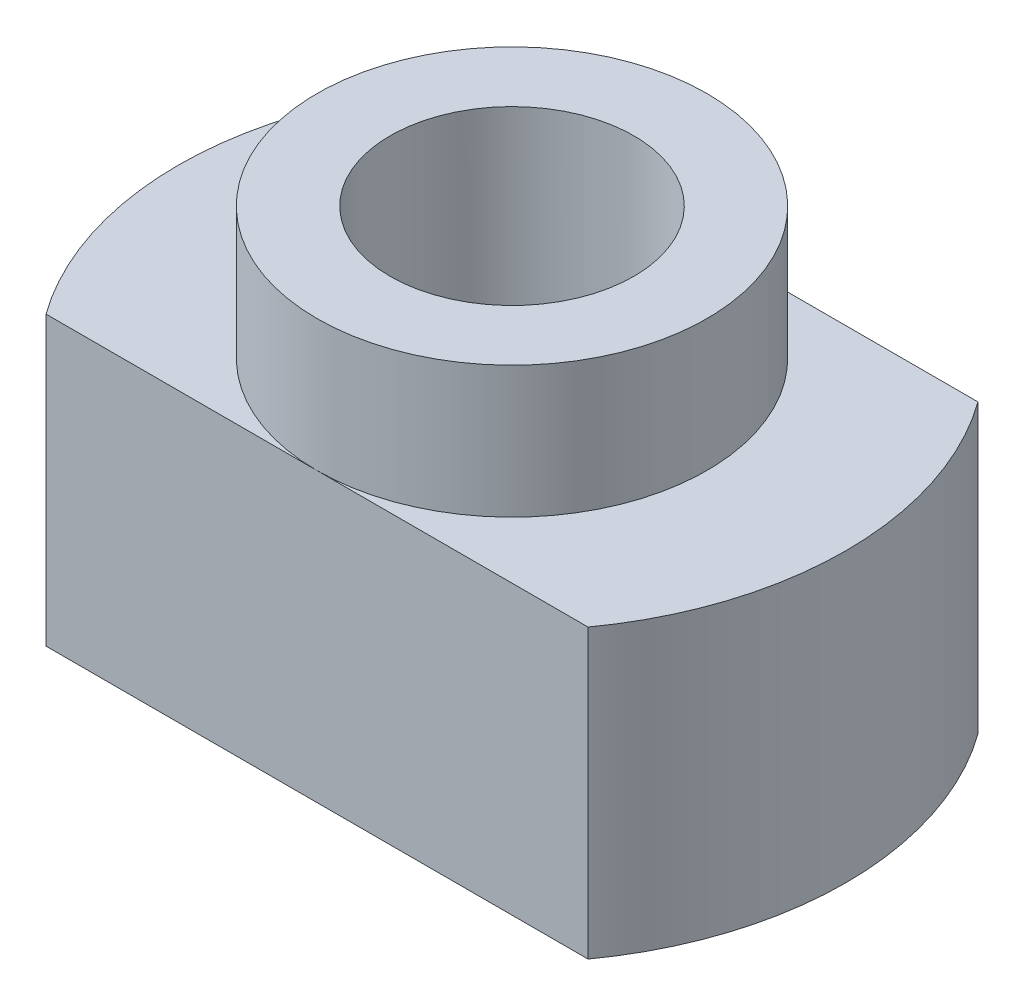
ISO-10303-21;
HEADER;
FILE_DESCRIPTION(('STEP AP214'),'2;1');
FILE_NAME('part.step','',(''),(''),'','','');
FILE_SCHEMA(('AUTOMOTIVE_DESIGN { 1 0 10303 214 1 1 1 1 }'));
ENDSEC;
DATA;
#1=APPLICATION_CONTEXT('core data for automotive mechanical design processes');
#2=APPLICATION_PROTOCOL_DEFINITION('international standard','automotive_design',2000,#1);
#3=PRODUCT_CONTEXT('',#1,'mechanical');
#4=PRODUCT('Part','Part','',(#3));
#5=PRODUCT_RELATED_PRODUCT_CATEGORY('part','',(#4));
#6=PRODUCT_DEFINITION_FORMATION('','',#4);
#7=PRODUCT_DEFINITION_CONTEXT('part definition',#1,'design');
#8=PRODUCT_DEFINITION('design','',#6,#7);
#9=PRODUCT_DEFINITION_SHAPE('','',#8);
#10=(LENGTH_UNIT() NAMED_UNIT(*) SI_UNIT(.MILLI.,.METRE.));
#11=(NAMED_UNIT(*) PLANE_ANGLE_UNIT() SI_UNIT($,.RADIAN.));
#12=(NAMED_UNIT(*) SI_UNIT($,.STERADIAN.) SOLID_ANGLE_UNIT());
#13=UNCERTAINTY_MEASURE_WITH_UNIT(LENGTH_MEASURE(1.E-05),#10,'distance_accuracy_value','');
#14=(GEOMETRIC_REPRESENTATION_CONTEXT(3) GLOBAL_UNCERTAINTY_ASSIGNED_CONTEXT((#13)) GLOBAL_UNIT_ASSIGNED_CONTEXT((#10,
#11,#12)) REPRESENTATION_CONTEXT('',''));
#15=CARTESIAN_POINT('',(0.,0.,0.));
#16=DIRECTION('',(0.,0.,1.));
#17=DIRECTION('',(1.,0.,0.));
#18=AXIS2_PLACEMENT_3D('',#15,#16,#17);
#19=CARTESIAN_POINT('',(6.84999999999991,5.90000000000003,0.));
#20=DIRECTION('',(0.,1.,0.));
#21=DIRECTION('',(0.,0.,1.));
#22=AXIS2_PLACEMENT_3D('',#19,#20,#21);
#23=PLANE('',#22);
#24=DIRECTION('',(-1.,0.,0.));
#25=VECTOR('',#24,1.);
#26=CARTESIAN_POINT('',(-11.2710822558912,5.90000000000003,4.));
#27=LINE('',#26,#25);
#28=CARTESIAN_POINT('',(5.56080030211468,5.90000000000003,4.));
#29=VERTEX_POINT('',#28);
#30=CARTESIAN_POINT('',(0.,5.90000000000003,4.));
#31=VERTEX_POINT('',#30);
#32=EDGE_CURVE('E85',#29,#31,#27,.T.);
#33=ORIENTED_EDGE('',*,*,#32,.F.);
#34=CARTESIAN_POINT('',(0.,5.89999999999998,0.));
#35=DIRECTION('',(0.,-1.,0.));
#36=DIRECTION('',(0.,0.,-1.));
#37=AXIS2_PLACEMENT_3D('',#34,#35,#36);
#38=CIRCLE('',#37,6.84999999999991);
#39=CARTESIAN_POINT('',(5.56080030211468,5.89999999999998,-4.));
#40=VERTEX_POINT('',#39);
#41=EDGE_CURVE('E95',#40,#29,#38,.T.);
#42=ORIENTED_EDGE('',*,*,#41,.F.);
#43=DIRECTION('',(1.,0.,0.));
#44=VECTOR('',#43,1.);
#45=CARTESIAN_POINT('',(-11.2710822558912,5.90000000000003,-4.));
#46=LINE('',#45,#44);
#47=CARTESIAN_POINT('',(0.,5.90000000000003,-4.));
#48=VERTEX_POINT('',#47);
#49=EDGE_CURVE('E61',#48,#40,#46,.T.);
#50=ORIENTED_EDGE('',*,*,#49,.F.);
#51=CARTESIAN_POINT('',(0.,5.90000000000009,0.));
#52=DIRECTION('',(0.,-1.,0.));
#53=DIRECTION('',(0.,0.,-1.));
#54=AXIS2_PLACEMENT_3D('',#51,#52,#53);
#55=CIRCLE('',#54,4.);
#56=EDGE_CURVE('E97',#48,#31,#55,.T.);
#57=ORIENTED_EDGE('',*,*,#56,.T.);
#58=EDGE_LOOP('',(#33,#42,#50,#57));
#59=FACE_BOUND('',#58,.T.);
#60=ADVANCED_FACE('F37',(#59),#23,.T.);
#61=CARTESIAN_POINT('',(0.,0.,0.));
#62=DIRECTION('',(0.,-1.,0.));
#63=DIRECTION('',(0.,0.,-1.));
#64=AXIS2_PLACEMENT_3D('',#61,#62,#63);
#65=CYLINDRICAL_SURFACE('',#64,6.84999999999991);
#66=DIRECTION('',(0.,-1.,0.));
#67=VECTOR('',#66,1.);
#68=CARTESIAN_POINT('',(5.56080030211468,0.,4.));
#69=LINE('',#68,#67);
#70=CARTESIAN_POINT('',(5.56080030211468,0.,4.));
#71=VERTEX_POINT('',#70);
#72=EDGE_CURVE('E11',#71,#29,#69,.F.);
#73=ORIENTED_EDGE('',*,*,#72,.F.);
#74=CARTESIAN_POINT('',(0.,0.,0.));
#75=DIRECTION('',(0.,-1.,0.));
#76=DIRECTION('',(0.,0.,-1.));
#77=AXIS2_PLACEMENT_3D('',#74,#75,#76);
#78=CIRCLE('',#77,6.84999999999991);
#79=CARTESIAN_POINT('',(5.56080030211468,0.,-4.));
#80=VERTEX_POINT('',#79);
#81=EDGE_CURVE('E105',#80,#71,#78,.T.);
#82=ORIENTED_EDGE('',*,*,#81,.F.);
#83=DIRECTION('',(0.,-1.,0.));
#84=VECTOR('',#83,1.);
#85=CARTESIAN_POINT('',(5.56080030211468,0.,-4.));
#86=LINE('',#85,#84);
#87=EDGE_CURVE('E100',#40,#80,#86,.T.);
#88=ORIENTED_EDGE('',*,*,#87,.F.);
#89=ORIENTED_EDGE('',*,*,#41,.T.);
#90=EDGE_LOOP('',(#73,#82,#88,#89));
#91=FACE_BOUND('',#90,.T.);
#92=ADVANCED_FACE('F99',(#91),#65,.T.);
#93=CARTESIAN_POINT('',(6.84999999999991,0.,0.));
#94=DIRECTION('',(0.,-1.,0.));
#95=DIRECTION('',(0.,0.,-1.));
#96=AXIS2_PLACEMENT_3D('',#93,#94,#95);
#97=PLANE('',#96);
#98=CARTESIAN_POINT('',(0.,0.,0.));
#99=DIRECTION('',(0.,-1.,0.));
#100=DIRECTION('',(0.,0.,-1.));
#101=AXIS2_PLACEMENT_3D('',#98,#99,#100);
#102=CIRCLE('',#101,2.5);
#103=CARTESIAN_POINT('',(0.,0.,-2.5));
#104=VERTEX_POINT('',#103);
#105=EDGE_CURVE('E41',#104,#104,#102,.T.);
#106=ORIENTED_EDGE('',*,*,#105,.F.);
#107=EDGE_LOOP('',(#106));
#108=FACE_BOUND('',#107,.T.);
#109=DIRECTION('',(-1.,0.,0.));
#110=VECTOR('',#109,1.);
#111=CARTESIAN_POINT('',(-11.2710822558912,0.,4.));
#112=LINE('',#111,#110);
#113=CARTESIAN_POINT('',(-5.56080030211468,0.,4.));
#114=VERTEX_POINT('',#113);
#115=EDGE_CURVE('E87',#71,#114,#112,.T.);
#116=ORIENTED_EDGE('',*,*,#115,.T.);
#117=CARTESIAN_POINT('',(-5.56080030211468,0.,-4.));
#118=VERTEX_POINT('',#117);
#119=EDGE_CURVE('E121',#114,#118,#78,.T.);
#120=ORIENTED_EDGE('',*,*,#119,.T.);
#121=DIRECTION('',(1.,0.,0.));
#122=VECTOR('',#121,1.);
#123=CARTESIAN_POINT('',(-11.2710822558912,0.,-4.));
#124=LINE('',#123,#122);
#125=EDGE_CURVE('E126',#118,#80,#124,.T.);
#126=ORIENTED_EDGE('',*,*,#125,.T.);
#127=ORIENTED_EDGE('',*,*,#81,.T.);
#128=EDGE_LOOP('',(#116,#120,#126,#127));
#129=FACE_BOUND('',#128,.T.);
#130=ADVANCED_FACE('F39',(#108,#129),#97,.T.);
#131=CARTESIAN_POINT('',(4.,8.60000000000002,0.));
#132=DIRECTION('',(0.,1.,0.));
#133=DIRECTION('',(0.,0.,1.));
#134=AXIS2_PLACEMENT_3D('',#131,#132,#133);
#135=PLANE('',#134);
#136=CARTESIAN_POINT('',(0.,8.60000000000002,0.));
#137=DIRECTION('',(0.,1.,0.));
#138=DIRECTION('',(0.,0.,1.));
#139=AXIS2_PLACEMENT_3D('',#136,#137,#138);
#140=CIRCLE('',#139,2.5);
#141=CARTESIAN_POINT('',(0.,8.60000000000002,2.5));
#142=VERTEX_POINT('',#141);
#143=EDGE_CURVE('E130',#142,#142,#140,.T.);
#144=ORIENTED_EDGE('',*,*,#143,.F.);
#145=EDGE_LOOP('',(#144));
#146=FACE_BOUND('',#145,.T.);
#147=CARTESIAN_POINT('',(0.,8.60000000000002,0.));
#148=DIRECTION('',(0.,-1.,0.));
#149=DIRECTION('',(0.,0.,-1.));
#150=AXIS2_PLACEMENT_3D('',#147,#148,#149);
#151=CIRCLE('',#150,4.);
#152=CARTESIAN_POINT('',(0.,8.60000000000002,-4.));
#153=VERTEX_POINT('',#152);
#154=EDGE_CURVE('E109',#153,#153,#151,.T.);
#155=ORIENTED_EDGE('',*,*,#154,.F.);
#156=EDGE_LOOP('',(#155));
#157=FACE_BOUND('',#156,.T.);
#158=ADVANCED_FACE('F140',(#146,#157),#135,.T.);
#159=CARTESIAN_POINT('',(0.,0.,0.));
#160=DIRECTION('',(0.,-1.,0.));
#161=DIRECTION('',(0.,0.,-1.));
#162=AXIS2_PLACEMENT_3D('',#159,#160,#161);
#163=CYLINDRICAL_SURFACE('',#162,4.);
#164=ORIENTED_EDGE('',*,*,#154,.T.);
#165=EDGE_LOOP('',(#164));
#166=FACE_BOUND('',#165,.T.);
#167=ORIENTED_EDGE('',*,*,#56,.F.);
#168=EDGE_CURVE('E101',#31,#48,#55,.T.);
#169=ORIENTED_EDGE('',*,*,#168,.F.);
#170=EDGE_LOOP('',(#167,#169));
#171=FACE_BOUND('',#170,.T.);
#172=ADVANCED_FACE('F145',(#166,#171),#163,.T.);
#173=CARTESIAN_POINT('',(-5.56080030211468,5.89999999999998,4.));
#174=VERTEX_POINT('',#173);
#175=EDGE_CURVE('E53',#31,#174,#27,.T.);
#176=ORIENTED_EDGE('',*,*,#175,.F.);
#177=ORIENTED_EDGE('',*,*,#168,.T.);
#178=CARTESIAN_POINT('',(-5.56080030211468,5.90000000000003,-4.));
#179=VERTEX_POINT('',#178);
#180=EDGE_CURVE('E127',#179,#48,#46,.T.);
#181=ORIENTED_EDGE('',*,*,#180,.F.);
#182=EDGE_CURVE('E102',#174,#179,#38,.T.);
#183=ORIENTED_EDGE('',*,*,#182,.F.);
#184=EDGE_LOOP('',(#176,#177,#181,#183));
#185=FACE_BOUND('',#184,.T.);
#186=ADVANCED_FACE('F150',(#185),#23,.T.);
#187=DIRECTION('',(0.,-1.,0.));
#188=VECTOR('',#187,1.);
#189=CARTESIAN_POINT('',(-5.56080030211468,0.,4.));
#190=LINE('',#189,#188);
#191=EDGE_CURVE('E46',#174,#114,#190,.T.);
#192=ORIENTED_EDGE('',*,*,#191,.F.);
#193=ORIENTED_EDGE('',*,*,#182,.T.);
#194=DIRECTION('',(0.,-1.,0.));
#195=VECTOR('',#194,1.);
#196=CARTESIAN_POINT('',(-5.56080030211468,0.,-4.));
#197=LINE('',#196,#195);
#198=EDGE_CURVE('E113',#118,#179,#197,.F.);
#199=ORIENTED_EDGE('',*,*,#198,.F.);
#200=ORIENTED_EDGE('',*,*,#119,.F.);
#201=EDGE_LOOP('',(#192,#193,#199,#200));
#202=FACE_BOUND('',#201,.T.);
#203=ADVANCED_FACE('F125',(#202),#65,.T.);
#204=CARTESIAN_POINT('',(-11.2710822558912,0.,-4.));
#205=DIRECTION('',(0.,0.,1.));
#206=DIRECTION('',(1.,0.,0.));
#207=AXIS2_PLACEMENT_3D('',#204,#205,#206);
#208=PLANE('',#207);
#209=ORIENTED_EDGE('',*,*,#198,.T.);
#210=ORIENTED_EDGE('',*,*,#180,.T.);
#211=ORIENTED_EDGE('',*,*,#49,.T.);
#212=ORIENTED_EDGE('',*,*,#87,.T.);
#213=ORIENTED_EDGE('',*,*,#125,.F.);
#214=EDGE_LOOP('',(#209,#210,#211,#212,#213));
#215=FACE_BOUND('',#214,.T.);
#216=ADVANCED_FACE('F160',(#215),#208,.F.);
#217=CARTESIAN_POINT('',(-11.2710822558912,0.,4.));
#218=DIRECTION('',(0.,0.,-1.));
#219=DIRECTION('',(-1.,0.,0.));
#220=AXIS2_PLACEMENT_3D('',#217,#218,#219);
#221=PLANE('',#220);
#222=ORIENTED_EDGE('',*,*,#72,.T.);
#223=ORIENTED_EDGE('',*,*,#32,.T.);
#224=ORIENTED_EDGE('',*,*,#175,.T.);
#225=ORIENTED_EDGE('',*,*,#191,.T.);
#226=ORIENTED_EDGE('',*,*,#115,.F.);
#227=EDGE_LOOP('',(#222,#223,#224,#225,#226));
#228=FACE_BOUND('',#227,.T.);
#229=ADVANCED_FACE('F84',(#228),#221,.F.);
#230=CARTESIAN_POINT('',(0.,8.60000000000002,0.));
#231=DIRECTION('',(0.,1.,0.));
#232=DIRECTION('',(0.,0.,1.));
#233=AXIS2_PLACEMENT_3D('',#230,#231,#232);
#234=CYLINDRICAL_SURFACE('',#233,2.5);
#235=ORIENTED_EDGE('',*,*,#105,.T.);
#236=EDGE_LOOP('',(#235));
#237=FACE_BOUND('',#236,.T.);
#238=ORIENTED_EDGE('',*,*,#143,.T.);
#239=EDGE_LOOP('',(#238));
#240=FACE_BOUND('',#239,.T.);
#241=ADVANCED_FACE('F137',(#237,#240),#234,.F.);
#242=CLOSED_SHELL('',(#60,#92,#130,#158,#172,#186,#203,#216,#229,#241));
#243=MANIFOLD_SOLID_BREP('B2',#242);
#244=ADVANCED_BREP_SHAPE_REPRESENTATION('',(#18,#243),#14);
#245=SHAPE_DEFINITION_REPRESENTATION(#9,#244);
ENDSEC;
END-ISO-10303-21;
